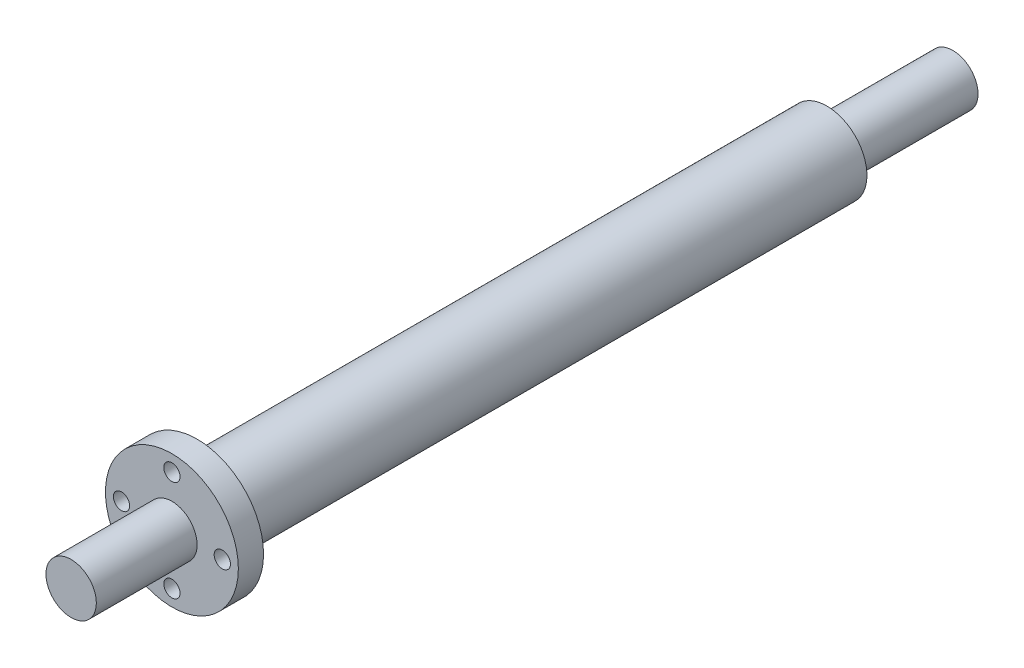
ISO-10303-21;
HEADER;
FILE_DESCRIPTION(('STEP AP214'),'2;1');
FILE_NAME('part.step','',(''),(''),'','','');
FILE_SCHEMA(('AUTOMOTIVE_DESIGN { 1 0 10303 214 1 1 1 1 }'));
ENDSEC;
DATA;
#1=APPLICATION_CONTEXT('core data for automotive mechanical design processes');
#2=APPLICATION_PROTOCOL_DEFINITION('international standard','automotive_design',2000,#1);
#3=PRODUCT_CONTEXT('',#1,'mechanical');
#4=PRODUCT('Part','Part','',(#3));
#5=PRODUCT_RELATED_PRODUCT_CATEGORY('part','',(#4));
#6=PRODUCT_DEFINITION_FORMATION('','',#4);
#7=PRODUCT_DEFINITION_CONTEXT('part definition',#1,'design');
#8=PRODUCT_DEFINITION('design','',#6,#7);
#9=PRODUCT_DEFINITION_SHAPE('','',#8);
#10=(LENGTH_UNIT() NAMED_UNIT(*) SI_UNIT(.MILLI.,.METRE.));
#11=(NAMED_UNIT(*) PLANE_ANGLE_UNIT() SI_UNIT($,.RADIAN.));
#12=(NAMED_UNIT(*) SI_UNIT($,.STERADIAN.) SOLID_ANGLE_UNIT());
#13=UNCERTAINTY_MEASURE_WITH_UNIT(LENGTH_MEASURE(1.E-05),#10,'distance_accuracy_value','');
#14=(GEOMETRIC_REPRESENTATION_CONTEXT(3) GLOBAL_UNCERTAINTY_ASSIGNED_CONTEXT((#13)) GLOBAL_UNIT_ASSIGNED_CONTEXT((#10,
#11,#12)) REPRESENTATION_CONTEXT('',''));
#15=CARTESIAN_POINT('',(0.,0.,0.));
#16=DIRECTION('',(0.,0.,1.));
#17=DIRECTION('',(1.,0.,0.));
#18=AXIS2_PLACEMENT_3D('',#15,#16,#17);
#19=CARTESIAN_POINT('',(0.,0.,-300.));
#20=DIRECTION('',(0.,0.,1.));
#21=DIRECTION('',(1.,0.,0.));
#22=AXIS2_PLACEMENT_3D('',#19,#20,#21);
#23=CYLINDRICAL_SURFACE('',#22,15.88);
#24=CARTESIAN_POINT('',(0.,0.,0.));
#25=DIRECTION('',(0.,0.,-1.));
#26=DIRECTION('',(-1.,0.,0.));
#27=AXIS2_PLACEMENT_3D('',#24,#25,#26);
#28=CIRCLE('',#27,15.88);
#29=CARTESIAN_POINT('',(-15.88,0.,0.));
#30=VERTEX_POINT('',#29);
#31=EDGE_CURVE('E10',#30,#30,#28,.T.);
#32=ORIENTED_EDGE('',*,*,#31,.T.);
#33=EDGE_LOOP('',(#32));
#34=FACE_BOUND('',#33,.T.);
#35=CARTESIAN_POINT('',(0.,0.,-250.));
#36=DIRECTION('',(0.,0.,-1.));
#37=DIRECTION('',(-1.,0.,0.));
#38=AXIS2_PLACEMENT_3D('',#35,#36,#37);
#39=CIRCLE('',#38,15.88);
#40=CARTESIAN_POINT('',(-15.88,0.,-250.));
#41=VERTEX_POINT('',#40);
#42=EDGE_CURVE('E46',#41,#41,#39,.T.);
#43=ORIENTED_EDGE('',*,*,#42,.F.);
#44=EDGE_LOOP('',(#43));
#45=FACE_BOUND('',#44,.T.);
#46=ADVANCED_FACE('F31',(#34,#45),#23,.T.);
#47=CARTESIAN_POINT('',(0.,0.,10.));
#48=DIRECTION('',(0.,0.,1.));
#49=DIRECTION('',(1.,0.,0.));
#50=AXIS2_PLACEMENT_3D('',#47,#48,#49);
#51=PLANE('',#50);
#52=CARTESIAN_POINT('',(0.,0.,10.));
#53=DIRECTION('',(0.,0.,1.));
#54=DIRECTION('',(1.,0.,0.));
#55=AXIS2_PLACEMENT_3D('',#52,#53,#54);
#56=CIRCLE('',#55,10.);
#57=CARTESIAN_POINT('',(10.,0.,10.));
#58=VERTEX_POINT('',#57);
#59=EDGE_CURVE('E52',#58,#58,#56,.T.);
#60=ORIENTED_EDGE('',*,*,#59,.F.);
#61=EDGE_LOOP('',(#60));
#62=FACE_BOUND('',#61,.T.);
#63=CARTESIAN_POINT('',(1.12952049642128E-12,-20.,10.));
#64=DIRECTION('',(0.,0.,1.));
#65=DIRECTION('',(1.,0.,0.));
#66=AXIS2_PLACEMENT_3D('',#63,#64,#65);
#67=CIRCLE('',#66,3.22851812643159);
#68=CARTESIAN_POINT('',(3.22851812643272,-20.,10.));
#69=VERTEX_POINT('',#68);
#70=EDGE_CURVE('E61',#69,#69,#67,.T.);
#71=ORIENTED_EDGE('',*,*,#70,.F.);
#72=EDGE_LOOP('',(#71));
#73=FACE_BOUND('',#72,.T.);
#74=CARTESIAN_POINT('',(0.,20.,10.));
#75=DIRECTION('',(0.,0.,1.));
#76=DIRECTION('',(1.,0.,0.));
#77=AXIS2_PLACEMENT_3D('',#74,#75,#76);
#78=CIRCLE('',#77,3.22851812643038);
#79=CARTESIAN_POINT('',(3.22851812643038,20.,10.));
#80=VERTEX_POINT('',#79);
#81=EDGE_CURVE('E73',#80,#80,#78,.T.);
#82=ORIENTED_EDGE('',*,*,#81,.F.);
#83=EDGE_LOOP('',(#82));
#84=FACE_BOUND('',#83,.T.);
#85=CARTESIAN_POINT('',(0.,0.,10.));
#86=DIRECTION('',(0.,0.,1.));
#87=DIRECTION('',(1.,0.,0.));
#88=AXIS2_PLACEMENT_3D('',#85,#86,#87);
#89=CIRCLE('',#88,26.3769930929362);
#90=CARTESIAN_POINT('',(26.3769930929362,0.,10.));
#91=VERTEX_POINT('',#90);
#92=EDGE_CURVE('E39',#91,#91,#89,.T.);
#93=ORIENTED_EDGE('',*,*,#92,.T.);
#94=EDGE_LOOP('',(#93));
#95=FACE_BOUND('',#94,.T.);
#96=CARTESIAN_POINT('',(20.0000000000006,5.64760248210638E-13,10.));
#97=DIRECTION('',(0.,0.,1.));
#98=DIRECTION('',(1.,0.,0.));
#99=AXIS2_PLACEMENT_3D('',#96,#97,#98);
#100=CIRCLE('',#99,3.22851812643082);
#101=CARTESIAN_POINT('',(23.2285181264314,5.64760248210638E-13,10.));
#102=VERTEX_POINT('',#101);
#103=EDGE_CURVE('E67',#102,#102,#100,.T.);
#104=ORIENTED_EDGE('',*,*,#103,.F.);
#105=EDGE_LOOP('',(#104));
#106=FACE_BOUND('',#105,.T.);
#107=CARTESIAN_POINT('',(-19.9999999999994,-5.67209541808933E-13,10.));
#108=DIRECTION('',(0.,0.,1.));
#109=DIRECTION('',(1.,0.,0.));
#110=AXIS2_PLACEMENT_3D('',#107,#108,#109);
#111=CIRCLE('',#110,3.22851812643129);
#112=CARTESIAN_POINT('',(-16.7714818735681,-5.67209541808933E-13,10.));
#113=VERTEX_POINT('',#112);
#114=EDGE_CURVE('E55',#113,#113,#111,.T.);
#115=ORIENTED_EDGE('',*,*,#114,.F.);
#116=EDGE_LOOP('',(#115));
#117=FACE_BOUND('',#116,.T.);
#118=ADVANCED_FACE('F97',(#62,#73,#84,#95,#106,#117),#51,.T.);
#119=CARTESIAN_POINT('',(0.,0.,0.));
#120=DIRECTION('',(0.,0.,1.));
#121=DIRECTION('',(1.,0.,0.));
#122=AXIS2_PLACEMENT_3D('',#119,#120,#121);
#123=PLANE('',#122);
#124=ORIENTED_EDGE('',*,*,#31,.F.);
#125=EDGE_LOOP('',(#124));
#126=FACE_BOUND('',#125,.T.);
#127=CARTESIAN_POINT('',(0.,0.,0.));
#128=DIRECTION('',(0.,0.,1.));
#129=DIRECTION('',(1.,0.,0.));
#130=AXIS2_PLACEMENT_3D('',#127,#128,#129);
#131=CIRCLE('',#130,26.3769930929362);
#132=CARTESIAN_POINT('',(26.3769930929362,0.,0.));
#133=VERTEX_POINT('',#132);
#134=EDGE_CURVE('E35',#133,#133,#131,.T.);
#135=ORIENTED_EDGE('',*,*,#134,.F.);
#136=EDGE_LOOP('',(#135));
#137=FACE_BOUND('',#136,.T.);
#138=CARTESIAN_POINT('',(0.,20.,0.));
#139=DIRECTION('',(0.,0.,1.));
#140=DIRECTION('',(1.,0.,0.));
#141=AXIS2_PLACEMENT_3D('',#138,#139,#140);
#142=CIRCLE('',#141,3.22851812643038);
#143=CARTESIAN_POINT('',(3.22851812643038,20.,0.));
#144=VERTEX_POINT('',#143);
#145=EDGE_CURVE('E70',#144,#144,#142,.T.);
#146=ORIENTED_EDGE('',*,*,#145,.T.);
#147=EDGE_LOOP('',(#146));
#148=FACE_BOUND('',#147,.T.);
#149=CARTESIAN_POINT('',(20.0000000000006,5.64760248210638E-13,0.));
#150=DIRECTION('',(0.,0.,1.));
#151=DIRECTION('',(1.,0.,0.));
#152=AXIS2_PLACEMENT_3D('',#149,#150,#151);
#153=CIRCLE('',#152,3.22851812643082);
#154=CARTESIAN_POINT('',(23.2285181264314,5.64760248210638E-13,0.));
#155=VERTEX_POINT('',#154);
#156=EDGE_CURVE('E64',#155,#155,#153,.T.);
#157=ORIENTED_EDGE('',*,*,#156,.T.);
#158=EDGE_LOOP('',(#157));
#159=FACE_BOUND('',#158,.T.);
#160=CARTESIAN_POINT('',(1.12952049642128E-12,-20.,0.));
#161=DIRECTION('',(0.,0.,1.));
#162=DIRECTION('',(1.,0.,0.));
#163=AXIS2_PLACEMENT_3D('',#160,#161,#162);
#164=CIRCLE('',#163,3.22851812643159);
#165=CARTESIAN_POINT('',(3.22851812643272,-20.,0.));
#166=VERTEX_POINT('',#165);
#167=EDGE_CURVE('E58',#166,#166,#164,.T.);
#168=ORIENTED_EDGE('',*,*,#167,.T.);
#169=EDGE_LOOP('',(#168));
#170=FACE_BOUND('',#169,.T.);
#171=CARTESIAN_POINT('',(-19.9999999999994,-5.67209541808933E-13,0.));
#172=DIRECTION('',(0.,0.,1.));
#173=DIRECTION('',(1.,0.,0.));
#174=AXIS2_PLACEMENT_3D('',#171,#172,#173);
#175=CIRCLE('',#174,3.22851812643129);
#176=CARTESIAN_POINT('',(-16.7714818735681,-5.67209541808933E-13,0.));
#177=VERTEX_POINT('',#176);
#178=EDGE_CURVE('E51',#177,#177,#175,.T.);
#179=ORIENTED_EDGE('',*,*,#178,.T.);
#180=EDGE_LOOP('',(#179));
#181=FACE_BOUND('',#180,.T.);
#182=ADVANCED_FACE('F79',(#126,#137,#148,#159,#170,#181),#123,.F.);
#183=CARTESIAN_POINT('',(0.,0.,10.));
#184=DIRECTION('',(0.,0.,-1.));
#185=DIRECTION('',(-1.,0.,0.));
#186=AXIS2_PLACEMENT_3D('',#183,#184,#185);
#187=CYLINDRICAL_SURFACE('',#186,26.3769930929362);
#188=ORIENTED_EDGE('',*,*,#92,.F.);
#189=EDGE_LOOP('',(#188));
#190=FACE_BOUND('',#189,.T.);
#191=ORIENTED_EDGE('',*,*,#134,.T.);
#192=EDGE_LOOP('',(#191));
#193=FACE_BOUND('',#192,.T.);
#194=ADVANCED_FACE('F33',(#190,#193),#187,.T.);
#195=CARTESIAN_POINT('',(0.,20.,10.));
#196=DIRECTION('',(0.,0.,-1.));
#197=DIRECTION('',(-1.,0.,0.));
#198=AXIS2_PLACEMENT_3D('',#195,#196,#197);
#199=CYLINDRICAL_SURFACE('',#198,3.22851812643038);
#200=ORIENTED_EDGE('',*,*,#81,.T.);
#201=EDGE_LOOP('',(#200));
#202=FACE_BOUND('',#201,.T.);
#203=ORIENTED_EDGE('',*,*,#145,.F.);
#204=EDGE_LOOP('',(#203));
#205=FACE_BOUND('',#204,.T.);
#206=ADVANCED_FACE('F82',(#202,#205),#199,.F.);
#207=CARTESIAN_POINT('',(20.0000000000006,5.64760248210638E-13,10.));
#208=DIRECTION('',(0.,0.,-1.));
#209=DIRECTION('',(-1.,0.,0.));
#210=AXIS2_PLACEMENT_3D('',#207,#208,#209);
#211=CYLINDRICAL_SURFACE('',#210,3.22851812643082);
#212=ORIENTED_EDGE('',*,*,#103,.T.);
#213=EDGE_LOOP('',(#212));
#214=FACE_BOUND('',#213,.T.);
#215=ORIENTED_EDGE('',*,*,#156,.F.);
#216=EDGE_LOOP('',(#215));
#217=FACE_BOUND('',#216,.T.);
#218=ADVANCED_FACE('F84',(#214,#217),#211,.F.);
#219=CARTESIAN_POINT('',(1.12952049642128E-12,-20.,10.));
#220=DIRECTION('',(0.,0.,-1.));
#221=DIRECTION('',(-1.,0.,0.));
#222=AXIS2_PLACEMENT_3D('',#219,#220,#221);
#223=CYLINDRICAL_SURFACE('',#222,3.22851812643159);
#224=ORIENTED_EDGE('',*,*,#70,.T.);
#225=EDGE_LOOP('',(#224));
#226=FACE_BOUND('',#225,.T.);
#227=ORIENTED_EDGE('',*,*,#167,.F.);
#228=EDGE_LOOP('',(#227));
#229=FACE_BOUND('',#228,.T.);
#230=ADVANCED_FACE('F91',(#226,#229),#223,.F.);
#231=CARTESIAN_POINT('',(-19.9999999999994,-5.67209541808933E-13,10.));
#232=DIRECTION('',(0.,0.,-1.));
#233=DIRECTION('',(-1.,0.,0.));
#234=AXIS2_PLACEMENT_3D('',#231,#232,#233);
#235=CYLINDRICAL_SURFACE('',#234,3.22851812643129);
#236=ORIENTED_EDGE('',*,*,#114,.T.);
#237=EDGE_LOOP('',(#236));
#238=FACE_BOUND('',#237,.T.);
#239=ORIENTED_EDGE('',*,*,#178,.F.);
#240=EDGE_LOOP('',(#239));
#241=FACE_BOUND('',#240,.T.);
#242=ADVANCED_FACE('F116',(#238,#241),#235,.F.);
#243=CARTESIAN_POINT('',(0.,0.,50.));
#244=DIRECTION('',(0.,0.,-1.));
#245=DIRECTION('',(-1.,0.,0.));
#246=AXIS2_PLACEMENT_3D('',#243,#244,#245);
#247=CYLINDRICAL_SURFACE('',#246,10.);
#248=CARTESIAN_POINT('',(0.,0.,50.));
#249=DIRECTION('',(0.,0.,1.));
#250=DIRECTION('',(1.,0.,0.));
#251=AXIS2_PLACEMENT_3D('',#248,#249,#250);
#252=CIRCLE('',#251,10.);
#253=CARTESIAN_POINT('',(10.,0.,50.));
#254=VERTEX_POINT('',#253);
#255=EDGE_CURVE('E48',#254,#254,#252,.T.);
#256=ORIENTED_EDGE('',*,*,#255,.F.);
#257=EDGE_LOOP('',(#256));
#258=FACE_BOUND('',#257,.T.);
#259=ORIENTED_EDGE('',*,*,#59,.T.);
#260=EDGE_LOOP('',(#259));
#261=FACE_BOUND('',#260,.T.);
#262=ADVANCED_FACE('F112',(#258,#261),#247,.T.);
#263=CARTESIAN_POINT('',(0.,0.,50.));
#264=DIRECTION('',(0.,0.,1.));
#265=DIRECTION('',(1.,0.,0.));
#266=AXIS2_PLACEMENT_3D('',#263,#264,#265);
#267=PLANE('',#266);
#268=ORIENTED_EDGE('',*,*,#255,.T.);
#269=EDGE_LOOP('',(#268));
#270=FACE_BOUND('',#269,.T.);
#271=ADVANCED_FACE('F108',(#270),#267,.T.);
#272=CARTESIAN_POINT('',(0.,0.,-250.));
#273=DIRECTION('',(0.,0.,-1.));
#274=DIRECTION('',(-1.,0.,0.));
#275=AXIS2_PLACEMENT_3D('',#272,#273,#274);
#276=PLANE('',#275);
#277=CARTESIAN_POINT('',(0.,0.,-250.));
#278=DIRECTION('',(0.,0.,-1.));
#279=DIRECTION('',(-1.,0.,0.));
#280=AXIS2_PLACEMENT_3D('',#277,#278,#279);
#281=CIRCLE('',#280,10.);
#282=CARTESIAN_POINT('',(-10.,0.,-250.));
#283=VERTEX_POINT('',#282);
#284=EDGE_CURVE('E220',#283,#283,#281,.T.);
#285=ORIENTED_EDGE('',*,*,#284,.F.);
#286=EDGE_LOOP('',(#285));
#287=FACE_BOUND('',#286,.T.);
#288=ORIENTED_EDGE('',*,*,#42,.T.);
#289=EDGE_LOOP('',(#288));
#290=FACE_BOUND('',#289,.T.);
#291=ADVANCED_FACE('F111',(#287,#290),#276,.T.);
#292=CARTESIAN_POINT('',(0.,0.,-250.));
#293=DIRECTION('',(0.,0.,-1.));
#294=DIRECTION('',(-1.,0.,0.));
#295=AXIS2_PLACEMENT_3D('',#292,#293,#294);
#296=CYLINDRICAL_SURFACE('',#295,10.);
#297=ORIENTED_EDGE('',*,*,#284,.T.);
#298=EDGE_LOOP('',(#297));
#299=FACE_BOUND('',#298,.T.);
#300=CARTESIAN_POINT('',(0.,0.,-300.));
#301=DIRECTION('',(0.,0.,-1.));
#302=DIRECTION('',(-1.,0.,0.));
#303=AXIS2_PLACEMENT_3D('',#300,#301,#302);
#304=CIRCLE('',#303,10.);
#305=CARTESIAN_POINT('',(-10.,0.,-300.));
#306=VERTEX_POINT('',#305);
#307=EDGE_CURVE('E218',#306,#306,#304,.T.);
#308=ORIENTED_EDGE('',*,*,#307,.F.);
#309=EDGE_LOOP('',(#308));
#310=FACE_BOUND('',#309,.T.);
#311=ADVANCED_FACE('F191',(#299,#310),#296,.T.);
#312=CARTESIAN_POINT('',(0.,0.,-300.));
#313=DIRECTION('',(0.,0.,-1.));
#314=DIRECTION('',(-1.,0.,0.));
#315=AXIS2_PLACEMENT_3D('',#312,#313,#314);
#316=PLANE('',#315);
#317=ORIENTED_EDGE('',*,*,#307,.T.);
#318=EDGE_LOOP('',(#317));
#319=FACE_BOUND('',#318,.T.);
#320=ADVANCED_FACE('F106',(#319),#316,.T.);
#321=CLOSED_SHELL('',(#46,#118,#182,#194,#206,#218,#230,#242,#262,#271,#291,#311,#320));
#322=MANIFOLD_SOLID_BREP('B2',#321);
#323=ADVANCED_BREP_SHAPE_REPRESENTATION('',(#18,#322),#14);
#324=SHAPE_DEFINITION_REPRESENTATION(#9,#323);
ENDSEC;
END-ISO-10303-21;
